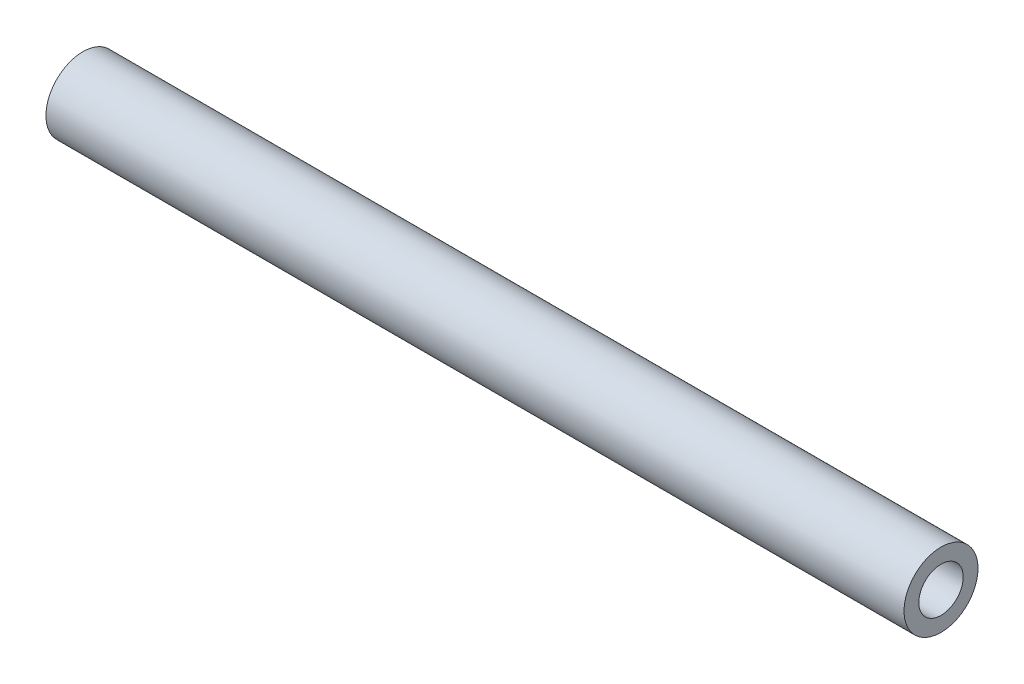
ISO-10303-21;
HEADER;
FILE_DESCRIPTION(('STEP AP214'),'2;1');
FILE_NAME('part.step','',(''),(''),'','','');
FILE_SCHEMA(('AUTOMOTIVE_DESIGN { 1 0 10303 214 1 1 1 1 }'));
ENDSEC;
DATA;
#1=APPLICATION_CONTEXT('core data for automotive mechanical design processes');
#2=APPLICATION_PROTOCOL_DEFINITION('international standard','automotive_design',2000,#1);
#3=PRODUCT_CONTEXT('',#1,'mechanical');
#4=PRODUCT('Part','Part','',(#3));
#5=PRODUCT_RELATED_PRODUCT_CATEGORY('part','',(#4));
#6=PRODUCT_DEFINITION_FORMATION('','',#4);
#7=PRODUCT_DEFINITION_CONTEXT('part definition',#1,'design');
#8=PRODUCT_DEFINITION('design','',#6,#7);
#9=PRODUCT_DEFINITION_SHAPE('','',#8);
#10=(LENGTH_UNIT() NAMED_UNIT(*) SI_UNIT(.MILLI.,.METRE.));
#11=(NAMED_UNIT(*) PLANE_ANGLE_UNIT() SI_UNIT($,.RADIAN.));
#12=(NAMED_UNIT(*) SI_UNIT($,.STERADIAN.) SOLID_ANGLE_UNIT());
#13=UNCERTAINTY_MEASURE_WITH_UNIT(LENGTH_MEASURE(1.E-05),#10,'distance_accuracy_value','');
#14=(GEOMETRIC_REPRESENTATION_CONTEXT(3) GLOBAL_UNCERTAINTY_ASSIGNED_CONTEXT((#13)) GLOBAL_UNIT_ASSIGNED_CONTEXT((#10,
#11,#12)) REPRESENTATION_CONTEXT('',''));
#15=CARTESIAN_POINT('',(0.,0.,0.));
#16=DIRECTION('',(0.,0.,1.));
#17=DIRECTION('',(1.,0.,0.));
#18=AXIS2_PLACEMENT_3D('',#15,#16,#17);
#19=CARTESIAN_POINT('',(92.075,0.,0.));
#20=DIRECTION('',(1.,0.,0.));
#21=DIRECTION('',(0.,0.,-1.));
#22=AXIS2_PLACEMENT_3D('',#19,#20,#21);
#23=PLANE('',#22);
#24=CARTESIAN_POINT('',(92.075,0.,0.));
#25=DIRECTION('',(1.,0.,0.));
#26=DIRECTION('',(0.,0.,-1.));
#27=AXIS2_PLACEMENT_3D('',#24,#25,#26);
#28=CIRCLE('',#27,7.9375);
#29=CARTESIAN_POINT('',(92.075,0.,-7.9375));
#30=VERTEX_POINT('',#29);
#31=EDGE_CURVE('E10',#30,#30,#28,.T.);
#32=ORIENTED_EDGE('',*,*,#31,.T.);
#33=EDGE_LOOP('',(#32));
#34=FACE_BOUND('',#33,.T.);
#35=CARTESIAN_POINT('',(92.075,0.,0.));
#36=DIRECTION('',(1.,0.,0.));
#37=DIRECTION('',(0.,0.,-1.));
#38=AXIS2_PLACEMENT_3D('',#35,#36,#37);
#39=CIRCLE('',#38,4.7625);
#40=CARTESIAN_POINT('',(92.075,0.,-4.7625));
#41=VERTEX_POINT('',#40);
#42=EDGE_CURVE('E42',#41,#41,#39,.T.);
#43=ORIENTED_EDGE('',*,*,#42,.F.);
#44=EDGE_LOOP('',(#43));
#45=FACE_BOUND('',#44,.T.);
#46=ADVANCED_FACE('F31',(#34,#45),#23,.T.);
#47=CARTESIAN_POINT('',(-92.075,0.,0.));
#48=DIRECTION('',(1.,0.,0.));
#49=DIRECTION('',(0.,0.,-1.));
#50=AXIS2_PLACEMENT_3D('',#47,#48,#49);
#51=PLANE('',#50);
#52=CARTESIAN_POINT('',(-92.075,0.,0.));
#53=DIRECTION('',(1.,0.,0.));
#54=DIRECTION('',(0.,0.,-1.));
#55=AXIS2_PLACEMENT_3D('',#52,#53,#54);
#56=CIRCLE('',#55,7.9375);
#57=CARTESIAN_POINT('',(-92.075,0.,-7.9375));
#58=VERTEX_POINT('',#57);
#59=EDGE_CURVE('E35',#58,#58,#56,.T.);
#60=ORIENTED_EDGE('',*,*,#59,.F.);
#61=EDGE_LOOP('',(#60));
#62=FACE_BOUND('',#61,.T.);
#63=CARTESIAN_POINT('',(-92.075,0.,0.));
#64=DIRECTION('',(1.,0.,0.));
#65=DIRECTION('',(0.,0.,-1.));
#66=AXIS2_PLACEMENT_3D('',#63,#64,#65);
#67=CIRCLE('',#66,4.7625);
#68=CARTESIAN_POINT('',(-92.075,0.,-4.7625));
#69=VERTEX_POINT('',#68);
#70=EDGE_CURVE('E44',#69,#69,#67,.T.);
#71=ORIENTED_EDGE('',*,*,#70,.T.);
#72=EDGE_LOOP('',(#71));
#73=FACE_BOUND('',#72,.T.);
#74=ADVANCED_FACE('F54',(#62,#73),#51,.F.);
#75=CARTESIAN_POINT('',(92.075,0.,0.));
#76=DIRECTION('',(-1.,0.,0.));
#77=DIRECTION('',(0.,0.,1.));
#78=AXIS2_PLACEMENT_3D('',#75,#76,#77);
#79=CYLINDRICAL_SURFACE('',#78,7.9375);
#80=ORIENTED_EDGE('',*,*,#31,.F.);
#81=EDGE_LOOP('',(#80));
#82=FACE_BOUND('',#81,.T.);
#83=ORIENTED_EDGE('',*,*,#59,.T.);
#84=EDGE_LOOP('',(#83));
#85=FACE_BOUND('',#84,.T.);
#86=ADVANCED_FACE('F33',(#82,#85),#79,.T.);
#87=CARTESIAN_POINT('',(92.075,0.,0.));
#88=DIRECTION('',(-1.,0.,0.));
#89=DIRECTION('',(0.,0.,1.));
#90=AXIS2_PLACEMENT_3D('',#87,#88,#89);
#91=CYLINDRICAL_SURFACE('',#90,4.7625);
#92=ORIENTED_EDGE('',*,*,#42,.T.);
#93=EDGE_LOOP('',(#92));
#94=FACE_BOUND('',#93,.T.);
#95=ORIENTED_EDGE('',*,*,#70,.F.);
#96=EDGE_LOOP('',(#95));
#97=FACE_BOUND('',#96,.T.);
#98=ADVANCED_FACE('F50',(#94,#97),#91,.F.);
#99=CLOSED_SHELL('',(#46,#74,#86,#98));
#100=MANIFOLD_SOLID_BREP('B2',#99);
#101=ADVANCED_BREP_SHAPE_REPRESENTATION('',(#18,#100),#14);
#102=SHAPE_DEFINITION_REPRESENTATION(#9,#101);
ENDSEC;
END-ISO-10303-21;
